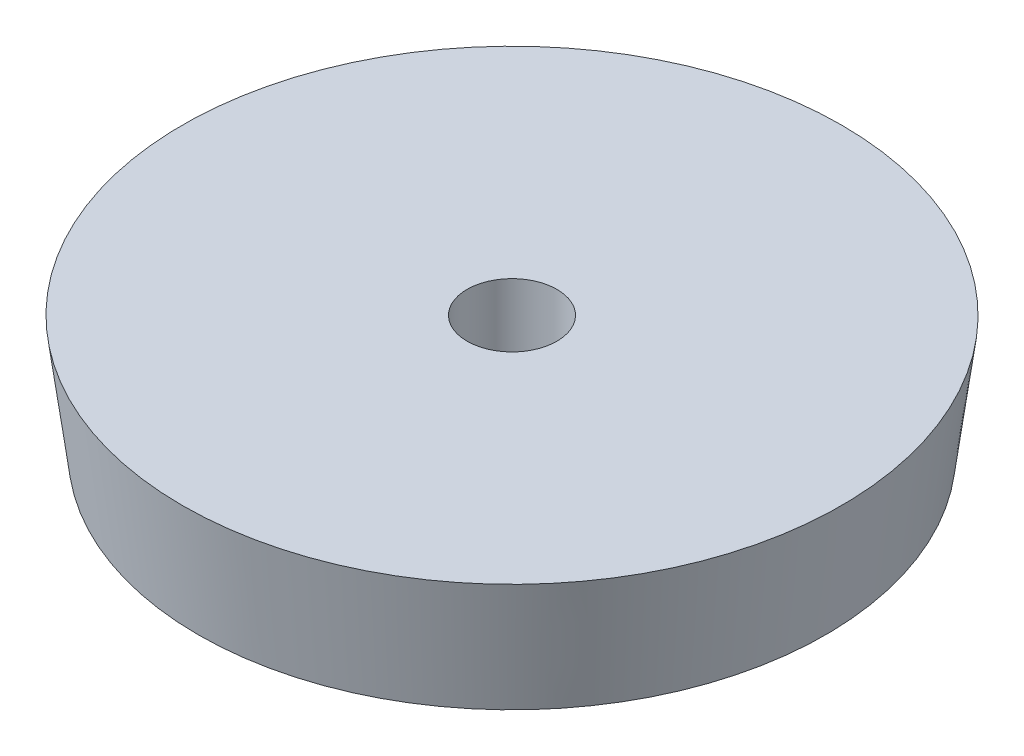
ISO-10303-21;
HEADER;
FILE_DESCRIPTION(('STEP AP214'),'2;1');
FILE_NAME('part.step','',(''),(''),'','','');
FILE_SCHEMA(('AUTOMOTIVE_DESIGN { 1 0 10303 214 1 1 1 1 }'));
ENDSEC;
DATA;
#1=APPLICATION_CONTEXT('core data for automotive mechanical design processes');
#2=APPLICATION_PROTOCOL_DEFINITION('international standard','automotive_design',2000,#1);
#3=PRODUCT_CONTEXT('',#1,'mechanical');
#4=PRODUCT('Part','Part','',(#3));
#5=PRODUCT_RELATED_PRODUCT_CATEGORY('part','',(#4));
#6=PRODUCT_DEFINITION_FORMATION('','',#4);
#7=PRODUCT_DEFINITION_CONTEXT('part definition',#1,'design');
#8=PRODUCT_DEFINITION('design','',#6,#7);
#9=PRODUCT_DEFINITION_SHAPE('','',#8);
#10=(LENGTH_UNIT() NAMED_UNIT(*) SI_UNIT(.MILLI.,.METRE.));
#11=(NAMED_UNIT(*) PLANE_ANGLE_UNIT() SI_UNIT($,.RADIAN.));
#12=(NAMED_UNIT(*) SI_UNIT($,.STERADIAN.) SOLID_ANGLE_UNIT());
#13=UNCERTAINTY_MEASURE_WITH_UNIT(LENGTH_MEASURE(1.E-05),#10,'distance_accuracy_value','');
#14=(GEOMETRIC_REPRESENTATION_CONTEXT(3) GLOBAL_UNCERTAINTY_ASSIGNED_CONTEXT((#13)) GLOBAL_UNIT_ASSIGNED_CONTEXT((#10,
#11,#12)) REPRESENTATION_CONTEXT('',''));
#15=CARTESIAN_POINT('',(0.,0.,0.));
#16=DIRECTION('',(0.,0.,1.));
#17=DIRECTION('',(1.,0.,0.));
#18=AXIS2_PLACEMENT_3D('',#15,#16,#17);
#19=CARTESIAN_POINT('',(0.,0.,0.));
#20=DIRECTION('',(0.,1.,0.));
#21=DIRECTION('',(0.,0.,1.));
#22=AXIS2_PLACEMENT_3D('',#19,#20,#21);
#23=CONICAL_SURFACE('',#22,104.775,0.130899693899575);
#24=CARTESIAN_POINT('',(0.,-38.1,0.));
#25=DIRECTION('',(0.,1.,0.));
#26=DIRECTION('',(0.,0.,1.));
#27=AXIS2_PLACEMENT_3D('',#24,#25,#26);
#28=CIRCLE('',#27,99.7590398419202);
#29=CARTESIAN_POINT('',(0.,-38.1,99.7590398419202));
#30=VERTEX_POINT('',#29);
#31=EDGE_CURVE('E10',#30,#30,#28,.T.);
#32=ORIENTED_EDGE('',*,*,#31,.T.);
#33=EDGE_LOOP('',(#32));
#34=FACE_BOUND('',#33,.T.);
#35=CARTESIAN_POINT('',(0.,0.,0.));
#36=DIRECTION('',(0.,1.,0.));
#37=DIRECTION('',(0.,0.,1.));
#38=AXIS2_PLACEMENT_3D('',#35,#36,#37);
#39=CIRCLE('',#38,104.775);
#40=CARTESIAN_POINT('',(0.,0.,104.775));
#41=VERTEX_POINT('',#40);
#42=EDGE_CURVE('E36',#41,#41,#39,.T.);
#43=ORIENTED_EDGE('',*,*,#42,.F.);
#44=EDGE_LOOP('',(#43));
#45=FACE_BOUND('',#44,.T.);
#46=ADVANCED_FACE('F30',(#34,#45),#23,.T.);
#47=CARTESIAN_POINT('',(0.,-38.1,0.));
#48=DIRECTION('',(0.,1.,0.));
#49=DIRECTION('',(0.,0.,1.));
#50=AXIS2_PLACEMENT_3D('',#47,#48,#49);
#51=PLANE('',#50);
#52=CARTESIAN_POINT('',(0.,-38.1,0.));
#53=DIRECTION('',(0.,1.,0.));
#54=DIRECTION('',(0.,0.,1.));
#55=AXIS2_PLACEMENT_3D('',#52,#53,#54);
#56=CIRCLE('',#55,14.2875);
#57=CARTESIAN_POINT('',(0.,-38.1,14.2875));
#58=VERTEX_POINT('',#57);
#59=EDGE_CURVE('E40',#58,#58,#56,.T.);
#60=ORIENTED_EDGE('',*,*,#59,.T.);
#61=EDGE_LOOP('',(#60));
#62=FACE_BOUND('',#61,.T.);
#63=ORIENTED_EDGE('',*,*,#31,.F.);
#64=EDGE_LOOP('',(#63));
#65=FACE_BOUND('',#64,.T.);
#66=ADVANCED_FACE('F54',(#62,#65),#51,.F.);
#67=CARTESIAN_POINT('',(0.,0.,0.));
#68=DIRECTION('',(0.,1.,0.));
#69=DIRECTION('',(0.,0.,1.));
#70=AXIS2_PLACEMENT_3D('',#67,#68,#69);
#71=PLANE('',#70);
#72=CARTESIAN_POINT('',(0.,0.,0.));
#73=DIRECTION('',(0.,1.,0.));
#74=DIRECTION('',(0.,0.,1.));
#75=AXIS2_PLACEMENT_3D('',#72,#73,#74);
#76=CIRCLE('',#75,14.2875);
#77=CARTESIAN_POINT('',(0.,0.,14.2875));
#78=VERTEX_POINT('',#77);
#79=EDGE_CURVE('E44',#78,#78,#76,.T.);
#80=ORIENTED_EDGE('',*,*,#79,.F.);
#81=EDGE_LOOP('',(#80));
#82=FACE_BOUND('',#81,.T.);
#83=ORIENTED_EDGE('',*,*,#42,.T.);
#84=EDGE_LOOP('',(#83));
#85=FACE_BOUND('',#84,.T.);
#86=ADVANCED_FACE('F52',(#82,#85),#71,.T.);
#87=CARTESIAN_POINT('',(0.,-38.1,0.));
#88=DIRECTION('',(0.,1.,0.));
#89=DIRECTION('',(0.,0.,1.));
#90=AXIS2_PLACEMENT_3D('',#87,#88,#89);
#91=CYLINDRICAL_SURFACE('',#90,14.2875);
#92=CARTESIAN_POINT('',(0.,-38.1,14.2875));
#93=CARTESIAN_POINT('',(0.,-37.703125,14.2875));
#94=CARTESIAN_POINT('',(0.,-37.30625,14.2875));
#95=CARTESIAN_POINT('',(0.,-36.5125,14.2875));
#96=CARTESIAN_POINT('',(0.,-36.115625,14.2875));
#97=CARTESIAN_POINT('',(0.,-35.321875,14.2875));
#98=CARTESIAN_POINT('',(0.,-34.925,14.2875));
#99=CARTESIAN_POINT('',(0.,-34.13125,14.2875));
#100=CARTESIAN_POINT('',(0.,-33.734375,14.2875));
#101=CARTESIAN_POINT('',(0.,-32.940625,14.2875));
#102=CARTESIAN_POINT('',(0.,-32.54375,14.2875));
#103=CARTESIAN_POINT('',(0.,-31.75,14.2875));
#104=CARTESIAN_POINT('',(0.,-31.353125,14.2875));
#105=CARTESIAN_POINT('',(0.,-30.559375,14.2875));
#106=CARTESIAN_POINT('',(0.,-30.1625,14.2875));
#107=CARTESIAN_POINT('',(0.,-29.36875,14.2875));
#108=CARTESIAN_POINT('',(0.,-28.971875,14.2875));
#109=CARTESIAN_POINT('',(0.,-28.178125,14.2875));
#110=CARTESIAN_POINT('',(0.,-27.78125,14.2875));
#111=CARTESIAN_POINT('',(0.,-26.9875,14.2875));
#112=CARTESIAN_POINT('',(0.,-26.590625,14.2875));
#113=CARTESIAN_POINT('',(0.,-25.796875,14.2875));
#114=CARTESIAN_POINT('',(0.,-25.4,14.2875));
#115=CARTESIAN_POINT('',(0.,-24.60625,14.2875));
#116=CARTESIAN_POINT('',(0.,-24.209375,14.2875));
#117=CARTESIAN_POINT('',(0.,-23.415625,14.2875));
#118=CARTESIAN_POINT('',(0.,-23.01875,14.2875));
#119=CARTESIAN_POINT('',(0.,-22.225,14.2875));
#120=CARTESIAN_POINT('',(0.,-21.828125,14.2875));
#121=CARTESIAN_POINT('',(0.,-21.034375,14.2875));
#122=CARTESIAN_POINT('',(0.,-20.6375,14.2875));
#123=CARTESIAN_POINT('',(0.,-19.84375,14.2875));
#124=CARTESIAN_POINT('',(0.,-19.446875,14.2875));
#125=CARTESIAN_POINT('',(0.,-18.653125,14.2875));
#126=CARTESIAN_POINT('',(0.,-18.25625,14.2875));
#127=CARTESIAN_POINT('',(0.,-17.4625,14.2875));
#128=CARTESIAN_POINT('',(0.,-17.065625,14.2875));
#129=CARTESIAN_POINT('',(0.,-16.271875,14.2875));
#130=CARTESIAN_POINT('',(0.,-15.875,14.2875));
#131=CARTESIAN_POINT('',(0.,-15.08125,14.2875));
#132=CARTESIAN_POINT('',(0.,-14.684375,14.2875));
#133=CARTESIAN_POINT('',(0.,-13.890625,14.2875));
#134=CARTESIAN_POINT('',(0.,-13.49375,14.2875));
#135=CARTESIAN_POINT('',(0.,-12.7,14.2875));
#136=CARTESIAN_POINT('',(0.,-12.303125,14.2875));
#137=CARTESIAN_POINT('',(0.,-11.509375,14.2875));
#138=CARTESIAN_POINT('',(0.,-11.1125,14.2875));
#139=CARTESIAN_POINT('',(0.,-10.31875,14.2875));
#140=CARTESIAN_POINT('',(0.,-9.921875,14.2875));
#141=CARTESIAN_POINT('',(0.,-9.128125,14.2875));
#142=CARTESIAN_POINT('',(0.,-8.73125,14.2875));
#143=CARTESIAN_POINT('',(0.,-7.9375,14.2875));
#144=CARTESIAN_POINT('',(0.,-7.540625,14.2875));
#145=CARTESIAN_POINT('',(0.,-6.746875,14.2875));
#146=CARTESIAN_POINT('',(0.,-6.35,14.2875));
#147=CARTESIAN_POINT('',(0.,-5.55625,14.2875));
#148=CARTESIAN_POINT('',(0.,-5.159375,14.2875));
#149=CARTESIAN_POINT('',(0.,-4.365625,14.2875));
#150=CARTESIAN_POINT('',(0.,-3.96875,14.2875));
#151=CARTESIAN_POINT('',(0.,-3.175,14.2875));
#152=CARTESIAN_POINT('',(0.,-2.778125,14.2875));
#153=CARTESIAN_POINT('',(0.,-1.984375,14.2875));
#154=CARTESIAN_POINT('',(0.,-1.5875,14.2875));
#155=CARTESIAN_POINT('',(0.,-0.79375,14.2875));
#156=CARTESIAN_POINT('',(0.,-0.396875,14.2875));
#157=CARTESIAN_POINT('',(0.,0.,14.2875));
#158=B_SPLINE_CURVE_WITH_KNOTS('',3,(#92,#93,#94,#95,#96,#97,#98,#99,#100,#101,#102,#103,#104,
#105,#106,#107,#108,#109,#110,#111,#112,#113,#114,#115,#116,#117,#118,#119,#120,#121,#122,#123,
#124,#125,#126,#127,#128,#129,#130,#131,#132,#133,#134,#135,#136,#137,#138,#139,#140,#141,#142,
#143,#144,#145,#146,#147,#148,#149,#150,#151,#152,#153,#154,#155,#156,#157),.UNSPECIFIED.,.F.,
.F.,(4,2,2,2,2,2,2,2,2,2,2,2,2,2,2,2,2,2,2,2,2,2,2,2,2,2,2,2,2,2,2,2,4),(0.,1.190625,2.38125,
3.571875,4.7625,5.953125,7.14375,8.334375,9.52500000000001,10.715625,11.90625,13.096875,14.2875,
15.478125,16.66875,17.859375,19.05,20.240625,21.43125,22.621875,23.8125,25.003125,26.19375,
27.384375,28.575,29.765625,30.95625,32.146875,33.3375,34.528125,35.71875,36.909375,38.1),.UNSPECIFIED.);
#159=EDGE_CURVE('BSEAM50',#58,#78,#158,.T.);
#160=ORIENTED_EDGE('',*,*,#59,.F.);
#161=ORIENTED_EDGE('',*,*,#79,.T.);
#162=ORIENTED_EDGE('',*,*,#159,.T.);
#163=ORIENTED_EDGE('',*,*,#159,.F.);
#164=EDGE_LOOP('',(#160,#162,#161,#163));
#165=FACE_BOUND('',#164,.T.);
#166=ADVANCED_FACE('F50',(#165),#91,.F.);
#167=CLOSED_SHELL('',(#46,#66,#86,#166));
#168=MANIFOLD_SOLID_BREP('B2',#167);
#169=ADVANCED_BREP_SHAPE_REPRESENTATION('',(#18,#168),#14);
#170=SHAPE_DEFINITION_REPRESENTATION(#9,#169);
ENDSEC;
END-ISO-10303-21;
